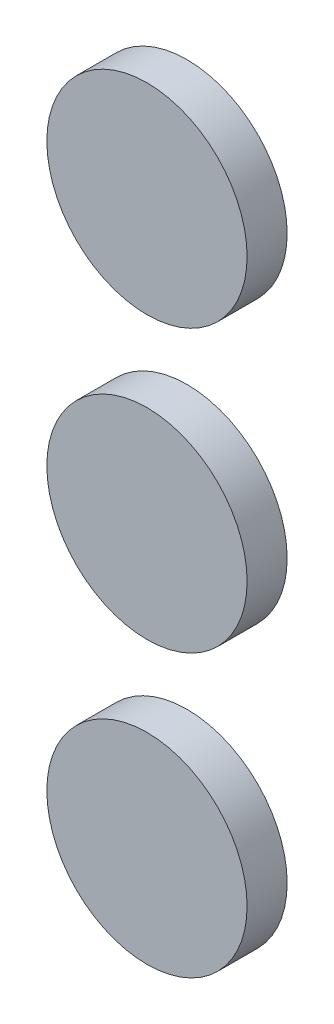
ISO-10303-21;
HEADER;
FILE_DESCRIPTION(('STEP AP214'),'2;1');
FILE_NAME('part.step','',(''),(''),'','','');
FILE_SCHEMA(('AUTOMOTIVE_DESIGN { 1 0 10303 214 1 1 1 1 }'));
ENDSEC;
DATA;
#1=APPLICATION_CONTEXT('core data for automotive mechanical design processes');
#2=APPLICATION_PROTOCOL_DEFINITION('international standard','automotive_design',2000,#1);
#3=PRODUCT_CONTEXT('',#1,'mechanical');
#4=PRODUCT('Part','Part','',(#3));
#5=PRODUCT_RELATED_PRODUCT_CATEGORY('part','',(#4));
#6=PRODUCT_DEFINITION_FORMATION('','',#4);
#7=PRODUCT_DEFINITION_CONTEXT('part definition',#1,'design');
#8=PRODUCT_DEFINITION('design','',#6,#7);
#9=PRODUCT_DEFINITION_SHAPE('','',#8);
#10=(LENGTH_UNIT() NAMED_UNIT(*) SI_UNIT(.MILLI.,.METRE.));
#11=(NAMED_UNIT(*) PLANE_ANGLE_UNIT() SI_UNIT($,.RADIAN.));
#12=(NAMED_UNIT(*) SI_UNIT($,.STERADIAN.) SOLID_ANGLE_UNIT());
#13=UNCERTAINTY_MEASURE_WITH_UNIT(LENGTH_MEASURE(1.E-05),#10,'distance_accuracy_value','');
#14=(GEOMETRIC_REPRESENTATION_CONTEXT(3) GLOBAL_UNCERTAINTY_ASSIGNED_CONTEXT((#13)) GLOBAL_UNIT_ASSIGNED_CONTEXT((#10,
#11,#12)) REPRESENTATION_CONTEXT('',''));
#15=CARTESIAN_POINT('',(0.,0.,0.));
#16=DIRECTION('',(0.,0.,1.));
#17=DIRECTION('',(1.,0.,0.));
#18=AXIS2_PLACEMENT_3D('',#15,#16,#17);
#19=CARTESIAN_POINT('',(43.9,61.2666006660038,0.5));
#20=DIRECTION('',(0.,0.,1.));
#21=DIRECTION('',(0.,-1.,0.));
#22=AXIS2_PLACEMENT_3D('',#19,#20,#21);
#23=ELLIPSE('',#22,1.2543327686242,1.25);
#24=DIRECTION('',(0.,0.,-1.));
#25=VECTOR('',#24,1.);
#26=SURFACE_OF_LINEAR_EXTRUSION('',#23,#25);
#27=CARTESIAN_POINT('',(43.9,60.0122678973796,0.5));
#28=VERTEX_POINT('',#27);
#29=EDGE_CURVE('E11',#28,#28,#23,.T.);
#30=ORIENTED_EDGE('',*,*,#29,.F.);
#31=EDGE_LOOP('',(#30));
#32=FACE_BOUND('',#31,.T.);
#33=CARTESIAN_POINT('',(43.9,61.2666006660038,0.));
#34=DIRECTION('',(0.,0.,1.));
#35=DIRECTION('',(0.,-1.,0.));
#36=AXIS2_PLACEMENT_3D('',#33,#34,#35);
#37=ELLIPSE('',#36,1.2543327686242,1.25);
#38=CARTESIAN_POINT('',(43.9,60.0122678973796,0.));
#39=VERTEX_POINT('',#38);
#40=EDGE_CURVE('E45',#39,#39,#37,.T.);
#41=ORIENTED_EDGE('',*,*,#40,.T.);
#42=EDGE_LOOP('',(#41));
#43=FACE_BOUND('',#42,.T.);
#44=ADVANCED_FACE('F41',(#32,#43),#26,.F.);
#45=CARTESIAN_POINT('',(43.9,61.2666006660038,0.5));
#46=DIRECTION('',(0.,0.,1.));
#47=DIRECTION('',(1.,0.,0.));
#48=AXIS2_PLACEMENT_3D('',#45,#46,#47);
#49=PLANE('',#48);
#50=ORIENTED_EDGE('',*,*,#29,.T.);
#51=EDGE_LOOP('',(#50));
#52=FACE_BOUND('',#51,.T.);
#53=ADVANCED_FACE('F57',(#52),#49,.T.);
#54=CARTESIAN_POINT('',(43.9,61.2666006660038,0.));
#55=DIRECTION('',(0.,0.,1.));
#56=DIRECTION('',(1.,0.,0.));
#57=AXIS2_PLACEMENT_3D('',#54,#55,#56);
#58=PLANE('',#57);
#59=ORIENTED_EDGE('',*,*,#40,.F.);
#60=EDGE_LOOP('',(#59));
#61=FACE_BOUND('',#60,.T.);
#62=ADVANCED_FACE('F55',(#61),#58,.F.);
#63=CLOSED_SHELL('',(#44,#53,#62));
#64=MANIFOLD_SOLID_BREP('B2',#63);
#65=CARTESIAN_POINT('',(43.9,57.7544689138561,0.5));
#66=DIRECTION('',(0.,0.,1.));
#67=DIRECTION('',(0.,-1.,0.));
#68=AXIS2_PLACEMENT_3D('',#65,#66,#67);
#69=ELLIPSE('',#68,1.2543327686242,1.25);
#70=DIRECTION('',(0.,0.,-1.));
#71=VECTOR('',#70,1.);
#72=SURFACE_OF_LINEAR_EXTRUSION('',#69,#71);
#73=CARTESIAN_POINT('',(43.9,56.5001361452319,0.5));
#74=VERTEX_POINT('',#73);
#75=EDGE_CURVE('E40',#74,#74,#69,.T.);
#76=ORIENTED_EDGE('',*,*,#75,.F.);
#77=EDGE_LOOP('',(#76));
#78=FACE_BOUND('',#77,.T.);
#79=CARTESIAN_POINT('',(43.9,57.7544689138561,0.));
#80=DIRECTION('',(0.,0.,1.));
#81=DIRECTION('',(0.,-1.,0.));
#82=AXIS2_PLACEMENT_3D('',#79,#80,#81);
#83=ELLIPSE('',#82,1.2543327686242,1.25);
#84=CARTESIAN_POINT('',(43.9,56.5001361452319,0.));
#85=VERTEX_POINT('',#84);
#86=EDGE_CURVE('E95',#85,#85,#83,.T.);
#87=ORIENTED_EDGE('',*,*,#86,.T.);
#88=EDGE_LOOP('',(#87));
#89=FACE_BOUND('',#88,.T.);
#90=ADVANCED_FACE('F91',(#78,#89),#72,.F.);
#91=CARTESIAN_POINT('',(43.9,57.7544689138561,0.5));
#92=DIRECTION('',(0.,0.,1.));
#93=DIRECTION('',(1.,0.,0.));
#94=AXIS2_PLACEMENT_3D('',#91,#92,#93);
#95=PLANE('',#94);
#96=ORIENTED_EDGE('',*,*,#75,.T.);
#97=EDGE_LOOP('',(#96));
#98=FACE_BOUND('',#97,.T.);
#99=ADVANCED_FACE('F107',(#98),#95,.T.);
#100=CARTESIAN_POINT('',(43.9,57.7544689138561,0.));
#101=DIRECTION('',(0.,0.,1.));
#102=DIRECTION('',(1.,0.,0.));
#103=AXIS2_PLACEMENT_3D('',#100,#101,#102);
#104=PLANE('',#103);
#105=ORIENTED_EDGE('',*,*,#86,.F.);
#106=EDGE_LOOP('',(#105));
#107=FACE_BOUND('',#106,.T.);
#108=ADVANCED_FACE('F105',(#107),#104,.F.);
#109=CLOSED_SHELL('',(#90,#99,#108));
#110=MANIFOLD_SOLID_BREP('B6',#109);
#111=CARTESIAN_POINT('',(43.9,54.2423371617083,0.5));
#112=DIRECTION('',(0.,0.,1.));
#113=DIRECTION('',(0.,-1.,0.));
#114=AXIS2_PLACEMENT_3D('',#111,#112,#113);
#115=ELLIPSE('',#114,1.2543327686242,1.25);
#116=DIRECTION('',(0.,0.,-1.));
#117=VECTOR('',#116,1.);
#118=SURFACE_OF_LINEAR_EXTRUSION('',#115,#117);
#119=CARTESIAN_POINT('',(43.9,52.9880043930841,0.5));
#120=VERTEX_POINT('',#119);
#121=EDGE_CURVE('E90',#120,#120,#115,.T.);
#122=ORIENTED_EDGE('',*,*,#121,.F.);
#123=EDGE_LOOP('',(#122));
#124=FACE_BOUND('',#123,.T.);
#125=CARTESIAN_POINT('',(43.9,54.2423371617083,0.));
#126=DIRECTION('',(0.,0.,1.));
#127=DIRECTION('',(0.,-1.,0.));
#128=AXIS2_PLACEMENT_3D('',#125,#126,#127);
#129=ELLIPSE('',#128,1.2543327686242,1.25);
#130=CARTESIAN_POINT('',(43.9,52.9880043930841,0.));
#131=VERTEX_POINT('',#130);
#132=EDGE_CURVE('E138',#131,#131,#129,.T.);
#133=ORIENTED_EDGE('',*,*,#132,.T.);
#134=EDGE_LOOP('',(#133));
#135=FACE_BOUND('',#134,.T.);
#136=ADVANCED_FACE('F134',(#124,#135),#118,.F.);
#137=CARTESIAN_POINT('',(43.9,54.2423371617083,0.5));
#138=DIRECTION('',(0.,0.,1.));
#139=DIRECTION('',(1.,0.,0.));
#140=AXIS2_PLACEMENT_3D('',#137,#138,#139);
#141=PLANE('',#140);
#142=ORIENTED_EDGE('',*,*,#121,.T.);
#143=EDGE_LOOP('',(#142));
#144=FACE_BOUND('',#143,.T.);
#145=ADVANCED_FACE('F150',(#144),#141,.T.);
#146=CARTESIAN_POINT('',(43.9,54.2423371617083,0.));
#147=DIRECTION('',(0.,0.,1.));
#148=DIRECTION('',(1.,0.,0.));
#149=AXIS2_PLACEMENT_3D('',#146,#147,#148);
#150=PLANE('',#149);
#151=ORIENTED_EDGE('',*,*,#132,.F.);
#152=EDGE_LOOP('',(#151));
#153=FACE_BOUND('',#152,.T.);
#154=ADVANCED_FACE('F148',(#153),#150,.F.);
#155=CLOSED_SHELL('',(#136,#145,#154));
#156=MANIFOLD_SOLID_BREP('B35',#155);
#157=ADVANCED_BREP_SHAPE_REPRESENTATION('',(#18,#64,#110,#156),#14);
#158=SHAPE_DEFINITION_REPRESENTATION(#9,#157);
ENDSEC;
END-ISO-10303-21;
